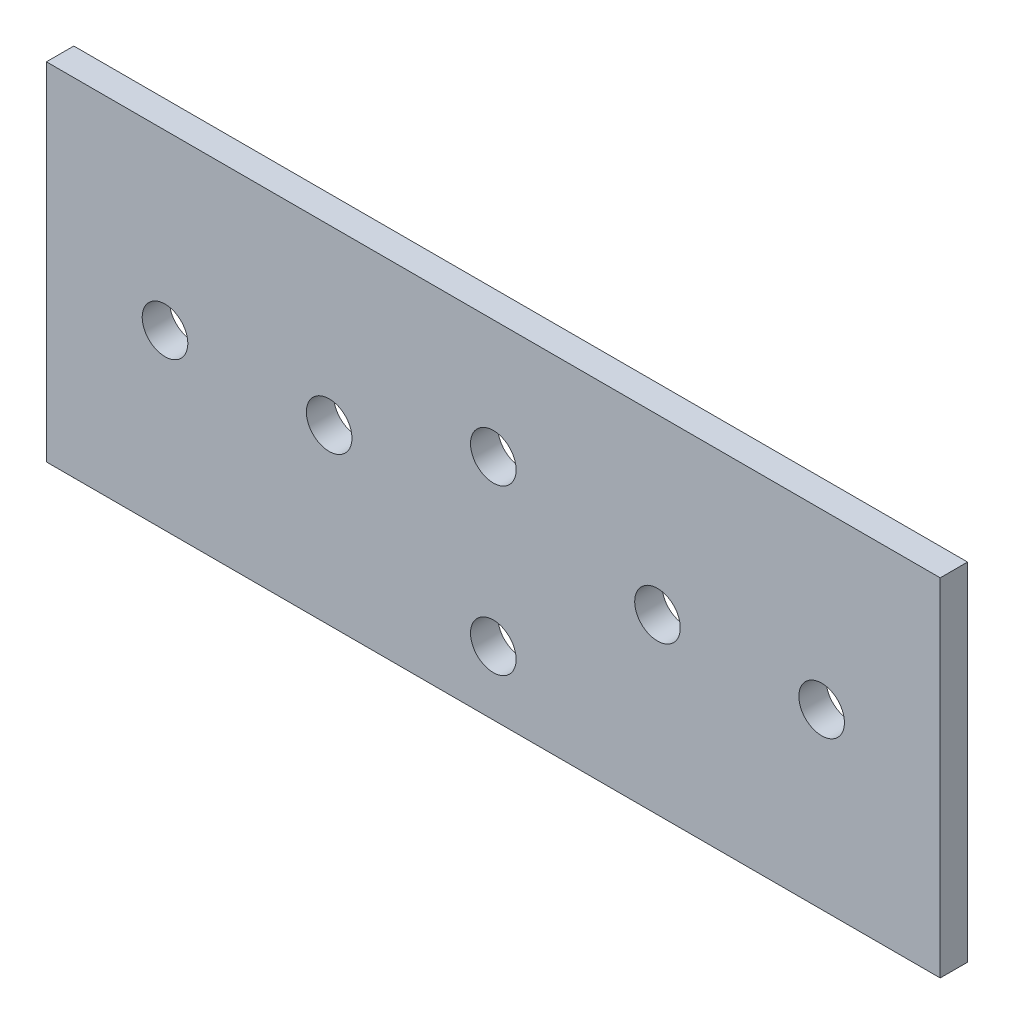
ISO-10303-21;
HEADER;
FILE_DESCRIPTION(('STEP AP214'),'2;1');
FILE_NAME('part.step','',(''),(''),'','','');
FILE_SCHEMA(('AUTOMOTIVE_DESIGN { 1 0 10303 214 1 1 1 1 }'));
ENDSEC;
DATA;
#1=APPLICATION_CONTEXT('core data for automotive mechanical design processes');
#2=APPLICATION_PROTOCOL_DEFINITION('international standard','automotive_design',2000,#1);
#3=PRODUCT_CONTEXT('',#1,'mechanical');
#4=PRODUCT('Part','Part','',(#3));
#5=PRODUCT_RELATED_PRODUCT_CATEGORY('part','',(#4));
#6=PRODUCT_DEFINITION_FORMATION('','',#4);
#7=PRODUCT_DEFINITION_CONTEXT('part definition',#1,'design');
#8=PRODUCT_DEFINITION('design','',#6,#7);
#9=PRODUCT_DEFINITION_SHAPE('','',#8);
#10=(LENGTH_UNIT() NAMED_UNIT(*) SI_UNIT(.MILLI.,.METRE.));
#11=(NAMED_UNIT(*) PLANE_ANGLE_UNIT() SI_UNIT($,.RADIAN.));
#12=(NAMED_UNIT(*) SI_UNIT($,.STERADIAN.) SOLID_ANGLE_UNIT());
#13=UNCERTAINTY_MEASURE_WITH_UNIT(LENGTH_MEASURE(1.E-05),#10,'distance_accuracy_value','');
#14=(GEOMETRIC_REPRESENTATION_CONTEXT(3) GLOBAL_UNCERTAINTY_ASSIGNED_CONTEXT((#13)) GLOBAL_UNIT_ASSIGNED_CONTEXT((#10,
#11,#12)) REPRESENTATION_CONTEXT('',''));
#15=CARTESIAN_POINT('',(0.,0.,0.));
#16=DIRECTION('',(0.,0.,1.));
#17=DIRECTION('',(1.,0.,0.));
#18=AXIS2_PLACEMENT_3D('',#15,#16,#17);
#19=CARTESIAN_POINT('',(49.,19.,3.));
#20=DIRECTION('',(-1.,0.,0.));
#21=DIRECTION('',(0.,-1.,0.));
#22=AXIS2_PLACEMENT_3D('',#19,#20,#21);
#23=PLANE('',#22);
#24=DIRECTION('',(0.,1.,0.));
#25=VECTOR('',#24,1.);
#26=CARTESIAN_POINT('',(49.,19.,0.));
#27=LINE('',#26,#25);
#28=CARTESIAN_POINT('',(49.,-19.,0.));
#29=VERTEX_POINT('',#28);
#30=CARTESIAN_POINT('',(49.,19.,0.));
#31=VERTEX_POINT('',#30);
#32=EDGE_CURVE('E106',#29,#31,#27,.T.);
#33=ORIENTED_EDGE('',*,*,#32,.T.);
#34=DIRECTION('',(0.,0.,-1.));
#35=VECTOR('',#34,1.);
#36=CARTESIAN_POINT('',(49.,19.,3.));
#37=LINE('',#36,#35);
#38=CARTESIAN_POINT('',(49.,19.,3.));
#39=VERTEX_POINT('',#38);
#40=EDGE_CURVE('E11',#39,#31,#37,.T.);
#41=ORIENTED_EDGE('',*,*,#40,.F.);
#42=DIRECTION('',(0.,1.,0.));
#43=VECTOR('',#42,1.);
#44=CARTESIAN_POINT('',(49.,19.,3.));
#45=LINE('',#44,#43);
#46=CARTESIAN_POINT('',(49.,-19.,3.));
#47=VERTEX_POINT('',#46);
#48=EDGE_CURVE('E90',#47,#39,#45,.T.);
#49=ORIENTED_EDGE('',*,*,#48,.F.);
#50=DIRECTION('',(0.,0.,-1.));
#51=VECTOR('',#50,1.);
#52=CARTESIAN_POINT('',(49.,-19.,3.));
#53=LINE('',#52,#51);
#54=EDGE_CURVE('E102',#47,#29,#53,.T.);
#55=ORIENTED_EDGE('',*,*,#54,.T.);
#56=EDGE_LOOP('',(#33,#41,#49,#55));
#57=FACE_BOUND('',#56,.T.);
#58=ADVANCED_FACE('F38',(#57),#23,.F.);
#59=CARTESIAN_POINT('',(-49.,19.,3.));
#60=DIRECTION('',(0.,-1.,0.));
#61=DIRECTION('',(0.,0.,-1.));
#62=AXIS2_PLACEMENT_3D('',#59,#60,#61);
#63=PLANE('',#62);
#64=DIRECTION('',(-1.,0.,0.));
#65=VECTOR('',#64,1.);
#66=CARTESIAN_POINT('',(-49.,19.,0.));
#67=LINE('',#66,#65);
#68=CARTESIAN_POINT('',(-49.,19.,0.));
#69=VERTEX_POINT('',#68);
#70=EDGE_CURVE('E95',#31,#69,#67,.T.);
#71=ORIENTED_EDGE('',*,*,#70,.T.);
#72=DIRECTION('',(0.,0.,-1.));
#73=VECTOR('',#72,1.);
#74=CARTESIAN_POINT('',(-49.,19.,3.));
#75=LINE('',#74,#73);
#76=CARTESIAN_POINT('',(-49.,19.,3.));
#77=VERTEX_POINT('',#76);
#78=EDGE_CURVE('E47',#77,#69,#75,.T.);
#79=ORIENTED_EDGE('',*,*,#78,.F.);
#80=DIRECTION('',(-1.,0.,0.));
#81=VECTOR('',#80,1.);
#82=CARTESIAN_POINT('',(-49.,19.,3.));
#83=LINE('',#82,#81);
#84=EDGE_CURVE('E85',#39,#77,#83,.T.);
#85=ORIENTED_EDGE('',*,*,#84,.F.);
#86=ORIENTED_EDGE('',*,*,#40,.T.);
#87=EDGE_LOOP('',(#71,#79,#85,#86));
#88=FACE_BOUND('',#87,.T.);
#89=ADVANCED_FACE('F94',(#88),#63,.F.);
#90=CARTESIAN_POINT('',(-49.,19.,3.));
#91=DIRECTION('',(1.,0.,0.));
#92=DIRECTION('',(0.,1.,0.));
#93=AXIS2_PLACEMENT_3D('',#90,#91,#92);
#94=PLANE('',#93);
#95=DIRECTION('',(0.,-1.,0.));
#96=VECTOR('',#95,1.);
#97=CARTESIAN_POINT('',(-49.,19.,0.));
#98=LINE('',#97,#96);
#99=CARTESIAN_POINT('',(-49.,-19.,0.));
#100=VERTEX_POINT('',#99);
#101=EDGE_CURVE('E72',#69,#100,#98,.T.);
#102=ORIENTED_EDGE('',*,*,#101,.T.);
#103=DIRECTION('',(0.,0.,-1.));
#104=VECTOR('',#103,1.);
#105=CARTESIAN_POINT('',(-49.,-19.,3.));
#106=LINE('',#105,#104);
#107=CARTESIAN_POINT('',(-49.,-19.,3.));
#108=VERTEX_POINT('',#107);
#109=EDGE_CURVE('E97',#108,#100,#106,.T.);
#110=ORIENTED_EDGE('',*,*,#109,.F.);
#111=DIRECTION('',(0.,-1.,0.));
#112=VECTOR('',#111,1.);
#113=CARTESIAN_POINT('',(-49.,19.,3.));
#114=LINE('',#113,#112);
#115=EDGE_CURVE('E88',#77,#108,#114,.T.);
#116=ORIENTED_EDGE('',*,*,#115,.F.);
#117=ORIENTED_EDGE('',*,*,#78,.T.);
#118=EDGE_LOOP('',(#102,#110,#116,#117));
#119=FACE_BOUND('',#118,.T.);
#120=ADVANCED_FACE('F98',(#119),#94,.F.);
#121=CARTESIAN_POINT('',(-49.,-19.,3.));
#122=DIRECTION('',(0.,1.,0.));
#123=DIRECTION('',(0.,0.,1.));
#124=AXIS2_PLACEMENT_3D('',#121,#122,#123);
#125=PLANE('',#124);
#126=DIRECTION('',(1.,0.,0.));
#127=VECTOR('',#126,1.);
#128=CARTESIAN_POINT('',(-49.,-19.,0.));
#129=LINE('',#128,#127);
#130=EDGE_CURVE('E78',#100,#29,#129,.T.);
#131=ORIENTED_EDGE('',*,*,#130,.T.);
#132=ORIENTED_EDGE('',*,*,#54,.F.);
#133=DIRECTION('',(1.,0.,0.));
#134=VECTOR('',#133,1.);
#135=CARTESIAN_POINT('',(-49.,-19.,3.));
#136=LINE('',#135,#134);
#137=EDGE_CURVE('E55',#108,#47,#136,.T.);
#138=ORIENTED_EDGE('',*,*,#137,.F.);
#139=ORIENTED_EDGE('',*,*,#109,.T.);
#140=EDGE_LOOP('',(#131,#132,#138,#139));
#141=FACE_BOUND('',#140,.T.);
#142=ADVANCED_FACE('F120',(#141),#125,.F.);
#143=CARTESIAN_POINT('',(0.,0.,3.));
#144=DIRECTION('',(0.,0.,1.));
#145=DIRECTION('',(1.,0.,0.));
#146=AXIS2_PLACEMENT_3D('',#143,#144,#145);
#147=PLANE('',#146);
#148=CARTESIAN_POINT('',(0.,-12.,3.));
#149=DIRECTION('',(0.,0.,1.));
#150=DIRECTION('',(1.,0.,0.));
#151=AXIS2_PLACEMENT_3D('',#148,#149,#150);
#152=CIRCLE('',#151,2.5);
#153=CARTESIAN_POINT('',(-2.5,-12.,3.));
#154=VERTEX_POINT('',#153);
#155=EDGE_CURVE('E167',#154,#154,#152,.F.);
#156=ORIENTED_EDGE('',*,*,#155,.T.);
#157=EDGE_LOOP('',(#156));
#158=FACE_BOUND('',#157,.T.);
#159=CARTESIAN_POINT('',(0.,6.,3.));
#160=DIRECTION('',(0.,0.,1.));
#161=DIRECTION('',(1.,0.,0.));
#162=AXIS2_PLACEMENT_3D('',#159,#160,#161);
#163=CIRCLE('',#162,2.5);
#164=CARTESIAN_POINT('',(-2.5,6.,3.));
#165=VERTEX_POINT('',#164);
#166=EDGE_CURVE('E159',#165,#165,#163,.F.);
#167=ORIENTED_EDGE('',*,*,#166,.T.);
#168=EDGE_LOOP('',(#167));
#169=FACE_BOUND('',#168,.T.);
#170=CARTESIAN_POINT('',(-36.,0.,3.));
#171=DIRECTION('',(0.,0.,1.));
#172=DIRECTION('',(1.,0.,0.));
#173=AXIS2_PLACEMENT_3D('',#170,#171,#172);
#174=CIRCLE('',#173,2.5);
#175=CARTESIAN_POINT('',(-38.5,0.,3.));
#176=VERTEX_POINT('',#175);
#177=EDGE_CURVE('E132',#176,#176,#174,.T.);
#178=ORIENTED_EDGE('',*,*,#177,.F.);
#179=EDGE_LOOP('',(#178));
#180=FACE_BOUND('',#179,.T.);
#181=CARTESIAN_POINT('',(-18.,0.,3.));
#182=DIRECTION('',(0.,0.,1.));
#183=DIRECTION('',(1.,0.,0.));
#184=AXIS2_PLACEMENT_3D('',#181,#182,#183);
#185=CIRCLE('',#184,2.5);
#186=CARTESIAN_POINT('',(-20.5,0.,3.));
#187=VERTEX_POINT('',#186);
#188=EDGE_CURVE('E143',#187,#187,#185,.T.);
#189=ORIENTED_EDGE('',*,*,#188,.F.);
#190=EDGE_LOOP('',(#189));
#191=FACE_BOUND('',#190,.T.);
#192=CARTESIAN_POINT('',(36.,0.,3.));
#193=DIRECTION('',(0.,0.,1.));
#194=DIRECTION('',(1.,0.,0.));
#195=AXIS2_PLACEMENT_3D('',#192,#193,#194);
#196=CIRCLE('',#195,2.5);
#197=CARTESIAN_POINT('',(33.5,0.,3.));
#198=VERTEX_POINT('',#197);
#199=EDGE_CURVE('E136',#198,#198,#196,.F.);
#200=ORIENTED_EDGE('',*,*,#199,.T.);
#201=EDGE_LOOP('',(#200));
#202=FACE_BOUND('',#201,.T.);
#203=CARTESIAN_POINT('',(18.,0.,3.));
#204=DIRECTION('',(0.,0.,1.));
#205=DIRECTION('',(1.,0.,0.));
#206=AXIS2_PLACEMENT_3D('',#203,#204,#205);
#207=CIRCLE('',#206,2.5);
#208=CARTESIAN_POINT('',(15.5,0.,3.));
#209=VERTEX_POINT('',#208);
#210=EDGE_CURVE('E127',#209,#209,#207,.F.);
#211=ORIENTED_EDGE('',*,*,#210,.T.);
#212=EDGE_LOOP('',(#211));
#213=FACE_BOUND('',#212,.T.);
#214=ORIENTED_EDGE('',*,*,#48,.T.);
#215=ORIENTED_EDGE('',*,*,#84,.T.);
#216=ORIENTED_EDGE('',*,*,#115,.T.);
#217=ORIENTED_EDGE('',*,*,#137,.T.);
#218=EDGE_LOOP('',(#214,#215,#216,#217));
#219=FACE_BOUND('',#218,.T.);
#220=ADVANCED_FACE('F86',(#158,#169,#180,#191,#202,#213,#219),#147,.T.);
#221=CARTESIAN_POINT('',(0.,0.,0.));
#222=DIRECTION('',(0.,0.,1.));
#223=DIRECTION('',(1.,0.,0.));
#224=AXIS2_PLACEMENT_3D('',#221,#222,#223);
#225=PLANE('',#224);
#226=CARTESIAN_POINT('',(0.,-12.,0.));
#227=DIRECTION('',(0.,0.,-1.));
#228=DIRECTION('',(-1.,0.,0.));
#229=AXIS2_PLACEMENT_3D('',#226,#227,#228);
#230=CIRCLE('',#229,2.5);
#231=CARTESIAN_POINT('',(-2.5,-12.,0.));
#232=VERTEX_POINT('',#231);
#233=EDGE_CURVE('E152',#232,#232,#230,.T.);
#234=ORIENTED_EDGE('',*,*,#233,.F.);
#235=EDGE_LOOP('',(#234));
#236=FACE_BOUND('',#235,.T.);
#237=CARTESIAN_POINT('',(0.,6.,0.));
#238=DIRECTION('',(0.,0.,-1.));
#239=DIRECTION('',(-1.,0.,0.));
#240=AXIS2_PLACEMENT_3D('',#237,#238,#239);
#241=CIRCLE('',#240,2.5);
#242=CARTESIAN_POINT('',(-2.5,6.,0.));
#243=VERTEX_POINT('',#242);
#244=EDGE_CURVE('E163',#243,#243,#241,.T.);
#245=ORIENTED_EDGE('',*,*,#244,.F.);
#246=EDGE_LOOP('',(#245));
#247=FACE_BOUND('',#246,.T.);
#248=CARTESIAN_POINT('',(-36.,0.,0.));
#249=DIRECTION('',(0.,0.,1.));
#250=DIRECTION('',(1.,0.,0.));
#251=AXIS2_PLACEMENT_3D('',#248,#249,#250);
#252=CIRCLE('',#251,2.5);
#253=CARTESIAN_POINT('',(-38.5,0.,0.));
#254=VERTEX_POINT('',#253);
#255=EDGE_CURVE('E147',#254,#254,#252,.T.);
#256=ORIENTED_EDGE('',*,*,#255,.T.);
#257=EDGE_LOOP('',(#256));
#258=FACE_BOUND('',#257,.T.);
#259=CARTESIAN_POINT('',(-18.,0.,0.));
#260=DIRECTION('',(0.,0.,1.));
#261=DIRECTION('',(1.,0.,0.));
#262=AXIS2_PLACEMENT_3D('',#259,#260,#261);
#263=CIRCLE('',#262,2.5);
#264=CARTESIAN_POINT('',(-20.5,0.,0.));
#265=VERTEX_POINT('',#264);
#266=EDGE_CURVE('E148',#265,#265,#263,.T.);
#267=ORIENTED_EDGE('',*,*,#266,.T.);
#268=EDGE_LOOP('',(#267));
#269=FACE_BOUND('',#268,.T.);
#270=CARTESIAN_POINT('',(36.,0.,0.));
#271=DIRECTION('',(0.,0.,-1.));
#272=DIRECTION('',(-1.,0.,0.));
#273=AXIS2_PLACEMENT_3D('',#270,#271,#272);
#274=CIRCLE('',#273,2.5);
#275=CARTESIAN_POINT('',(33.5,0.,0.));
#276=VERTEX_POINT('',#275);
#277=EDGE_CURVE('E110',#276,#276,#274,.T.);
#278=ORIENTED_EDGE('',*,*,#277,.F.);
#279=EDGE_LOOP('',(#278));
#280=FACE_BOUND('',#279,.T.);
#281=CARTESIAN_POINT('',(18.,0.,0.));
#282=DIRECTION('',(0.,0.,-1.));
#283=DIRECTION('',(-1.,0.,0.));
#284=AXIS2_PLACEMENT_3D('',#281,#282,#283);
#285=CIRCLE('',#284,2.5);
#286=CARTESIAN_POINT('',(15.5,0.,0.));
#287=VERTEX_POINT('',#286);
#288=EDGE_CURVE('E131',#287,#287,#285,.T.);
#289=ORIENTED_EDGE('',*,*,#288,.F.);
#290=EDGE_LOOP('',(#289));
#291=FACE_BOUND('',#290,.T.);
#292=ORIENTED_EDGE('',*,*,#32,.F.);
#293=ORIENTED_EDGE('',*,*,#130,.F.);
#294=ORIENTED_EDGE('',*,*,#101,.F.);
#295=ORIENTED_EDGE('',*,*,#70,.F.);
#296=EDGE_LOOP('',(#292,#293,#294,#295));
#297=FACE_BOUND('',#296,.T.);
#298=ADVANCED_FACE('F123',(#236,#247,#258,#269,#280,#291,#297),#225,.F.);
#299=CARTESIAN_POINT('',(18.,0.,3.001));
#300=DIRECTION('',(0.,0.,-1.));
#301=DIRECTION('',(-1.,0.,0.));
#302=AXIS2_PLACEMENT_3D('',#299,#300,#301);
#303=CYLINDRICAL_SURFACE('',#302,2.5);
#304=CARTESIAN_POINT('',(15.5,0.,3.));
#305=CARTESIAN_POINT('',(15.5,0.,2.96875));
#306=CARTESIAN_POINT('',(15.5,0.,2.9375));
#307=CARTESIAN_POINT('',(15.5,0.,2.875));
#308=CARTESIAN_POINT('',(15.5,0.,2.84375));
#309=CARTESIAN_POINT('',(15.5,0.,2.78125));
#310=CARTESIAN_POINT('',(15.5,0.,2.75));
#311=CARTESIAN_POINT('',(15.5,0.,2.6875));
#312=CARTESIAN_POINT('',(15.5,0.,2.65625));
#313=CARTESIAN_POINT('',(15.5,0.,2.59375));
#314=CARTESIAN_POINT('',(15.5,0.,2.5625));
#315=CARTESIAN_POINT('',(15.5,0.,2.5));
#316=CARTESIAN_POINT('',(15.5,0.,2.46875));
#317=CARTESIAN_POINT('',(15.5,0.,2.40625));
#318=CARTESIAN_POINT('',(15.5,0.,2.375));
#319=CARTESIAN_POINT('',(15.5,0.,2.3125));
#320=CARTESIAN_POINT('',(15.5,0.,2.28125));
#321=CARTESIAN_POINT('',(15.5,0.,2.21875));
#322=CARTESIAN_POINT('',(15.5,0.,2.1875));
#323=CARTESIAN_POINT('',(15.5,0.,2.125));
#324=CARTESIAN_POINT('',(15.5,0.,2.09375));
#325=CARTESIAN_POINT('',(15.5,0.,2.03125));
#326=CARTESIAN_POINT('',(15.5,0.,2.));
#327=CARTESIAN_POINT('',(15.5,0.,1.9375));
#328=CARTESIAN_POINT('',(15.5,0.,1.90625));
#329=CARTESIAN_POINT('',(15.5,0.,1.84375));
#330=CARTESIAN_POINT('',(15.5,0.,1.8125));
#331=CARTESIAN_POINT('',(15.5,0.,1.75));
#332=CARTESIAN_POINT('',(15.5,0.,1.71875));
#333=CARTESIAN_POINT('',(15.5,0.,1.65625));
#334=CARTESIAN_POINT('',(15.5,0.,1.625));
#335=CARTESIAN_POINT('',(15.5,0.,1.5625));
#336=CARTESIAN_POINT('',(15.5,0.,1.53125));
#337=CARTESIAN_POINT('',(15.5,0.,1.46875));
#338=CARTESIAN_POINT('',(15.5,0.,1.4375));
#339=CARTESIAN_POINT('',(15.5,0.,1.375));
#340=CARTESIAN_POINT('',(15.5,0.,1.34375));
#341=CARTESIAN_POINT('',(15.5,0.,1.28125));
#342=CARTESIAN_POINT('',(15.5,0.,1.25));
#343=CARTESIAN_POINT('',(15.5,0.,1.1875));
#344=CARTESIAN_POINT('',(15.5,0.,1.15625));
#345=CARTESIAN_POINT('',(15.5,0.,1.09375));
#346=CARTESIAN_POINT('',(15.5,0.,1.0625));
#347=CARTESIAN_POINT('',(15.5,0.,1.));
#348=CARTESIAN_POINT('',(15.5,0.,0.96875));
#349=CARTESIAN_POINT('',(15.5,0.,0.90625));
#350=CARTESIAN_POINT('',(15.5,0.,0.875));
#351=CARTESIAN_POINT('',(15.5,0.,0.8125));
#352=CARTESIAN_POINT('',(15.5,0.,0.78125));
#353=CARTESIAN_POINT('',(15.5,0.,0.71875));
#354=CARTESIAN_POINT('',(15.5,0.,0.6875));
#355=CARTESIAN_POINT('',(15.5,0.,0.625));
#356=CARTESIAN_POINT('',(15.5,0.,0.59375));
#357=CARTESIAN_POINT('',(15.5,0.,0.53125));
#358=CARTESIAN_POINT('',(15.5,0.,0.5));
#359=CARTESIAN_POINT('',(15.5,0.,0.4375));
#360=CARTESIAN_POINT('',(15.5,0.,0.40625));
#361=CARTESIAN_POINT('',(15.5,0.,0.34375));
#362=CARTESIAN_POINT('',(15.5,0.,0.3125));
#363=CARTESIAN_POINT('',(15.5,0.,0.25));
#364=CARTESIAN_POINT('',(15.5,0.,0.21875));
#365=CARTESIAN_POINT('',(15.5,0.,0.156250000000001));
#366=CARTESIAN_POINT('',(15.5,0.,0.125000000000001));
#367=CARTESIAN_POINT('',(15.5,0.,0.0625000000000005));
#368=CARTESIAN_POINT('',(15.5,0.,0.0312500000000005));
#369=CARTESIAN_POINT('',(15.5,0.,0.));
#370=B_SPLINE_CURVE_WITH_KNOTS('',3,(#304,#305,#306,#307,#308,#309,#310,#311,#312,#313,#314,
#315,#316,#317,#318,#319,#320,#321,#322,#323,#324,#325,#326,#327,#328,#329,#330,#331,#332,#333,
#334,#335,#336,#337,#338,#339,#340,#341,#342,#343,#344,#345,#346,#347,#348,#349,#350,#351,#352,
#353,#354,#355,#356,#357,#358,#359,#360,#361,#362,#363,#364,#365,#366,#367,#368,#369),
.UNSPECIFIED.,.F.,.F.,(4,2,2,2,2,2,2,2,2,2,2,2,2,2,2,2,2,2,2,2,2,2,2,2,2,2,2,2,2,2,2,2,4),(0.,
0.0937499999999997,0.1875,0.28125,0.375,0.46875,0.5625,0.65625,0.749999999999999,
0.843749999999999,0.9375,1.03125,1.125,1.21875,1.3125,1.40625,1.5,1.59375,1.6875,1.78125,1.875,
1.96875,2.0625,2.15625,2.25,2.34375,2.4375,2.53125,2.625,2.71875,2.8125,2.90625,3.),.UNSPECIFIED.);
#371=EDGE_CURVE('BSEAM179',#209,#287,#370,.T.);
#372=ORIENTED_EDGE('',*,*,#210,.F.);
#373=ORIENTED_EDGE('',*,*,#288,.T.);
#374=ORIENTED_EDGE('',*,*,#371,.T.);
#375=ORIENTED_EDGE('',*,*,#371,.F.);
#376=EDGE_LOOP('',(#372,#374,#373,#375));
#377=FACE_BOUND('',#376,.T.);
#378=ADVANCED_FACE('F179',(#377),#303,.F.);
#379=CARTESIAN_POINT('',(36.,0.,3.001));
#380=DIRECTION('',(0.,0.,-1.));
#381=DIRECTION('',(-1.,0.,0.));
#382=AXIS2_PLACEMENT_3D('',#379,#380,#381);
#383=CYLINDRICAL_SURFACE('',#382,2.5);
#384=CARTESIAN_POINT('',(33.5,0.,3.));
#385=CARTESIAN_POINT('',(33.5,0.,2.96875));
#386=CARTESIAN_POINT('',(33.5,0.,2.9375));
#387=CARTESIAN_POINT('',(33.5,0.,2.875));
#388=CARTESIAN_POINT('',(33.5,0.,2.84375));
#389=CARTESIAN_POINT('',(33.5,0.,2.78125));
#390=CARTESIAN_POINT('',(33.5,0.,2.75));
#391=CARTESIAN_POINT('',(33.5,0.,2.6875));
#392=CARTESIAN_POINT('',(33.5,0.,2.65625));
#393=CARTESIAN_POINT('',(33.5,0.,2.59375));
#394=CARTESIAN_POINT('',(33.5,0.,2.5625));
#395=CARTESIAN_POINT('',(33.5,0.,2.5));
#396=CARTESIAN_POINT('',(33.5,0.,2.46875));
#397=CARTESIAN_POINT('',(33.5,0.,2.40625));
#398=CARTESIAN_POINT('',(33.5,0.,2.375));
#399=CARTESIAN_POINT('',(33.5,0.,2.3125));
#400=CARTESIAN_POINT('',(33.5,0.,2.28125));
#401=CARTESIAN_POINT('',(33.5,0.,2.21875));
#402=CARTESIAN_POINT('',(33.5,0.,2.1875));
#403=CARTESIAN_POINT('',(33.5,0.,2.125));
#404=CARTESIAN_POINT('',(33.5,0.,2.09375));
#405=CARTESIAN_POINT('',(33.5,0.,2.03125));
#406=CARTESIAN_POINT('',(33.5,0.,2.));
#407=CARTESIAN_POINT('',(33.5,0.,1.9375));
#408=CARTESIAN_POINT('',(33.5,0.,1.90625));
#409=CARTESIAN_POINT('',(33.5,0.,1.84375));
#410=CARTESIAN_POINT('',(33.5,0.,1.8125));
#411=CARTESIAN_POINT('',(33.5,0.,1.75));
#412=CARTESIAN_POINT('',(33.5,0.,1.71875));
#413=CARTESIAN_POINT('',(33.5,0.,1.65625));
#414=CARTESIAN_POINT('',(33.5,0.,1.625));
#415=CARTESIAN_POINT('',(33.5,0.,1.5625));
#416=CARTESIAN_POINT('',(33.5,0.,1.53125));
#417=CARTESIAN_POINT('',(33.5,0.,1.46875));
#418=CARTESIAN_POINT('',(33.5,0.,1.4375));
#419=CARTESIAN_POINT('',(33.5,0.,1.375));
#420=CARTESIAN_POINT('',(33.5,0.,1.34375));
#421=CARTESIAN_POINT('',(33.5,0.,1.28125));
#422=CARTESIAN_POINT('',(33.5,0.,1.25));
#423=CARTESIAN_POINT('',(33.5,0.,1.1875));
#424=CARTESIAN_POINT('',(33.5,0.,1.15625));
#425=CARTESIAN_POINT('',(33.5,0.,1.09375));
#426=CARTESIAN_POINT('',(33.5,0.,1.0625));
#427=CARTESIAN_POINT('',(33.5,0.,1.));
#428=CARTESIAN_POINT('',(33.5,0.,0.96875));
#429=CARTESIAN_POINT('',(33.5,0.,0.90625));
#430=CARTESIAN_POINT('',(33.5,0.,0.875));
#431=CARTESIAN_POINT('',(33.5,0.,0.8125));
#432=CARTESIAN_POINT('',(33.5,0.,0.78125));
#433=CARTESIAN_POINT('',(33.5,0.,0.71875));
#434=CARTESIAN_POINT('',(33.5,0.,0.6875));
#435=CARTESIAN_POINT('',(33.5,0.,0.625));
#436=CARTESIAN_POINT('',(33.5,0.,0.59375));
#437=CARTESIAN_POINT('',(33.5,0.,0.53125));
#438=CARTESIAN_POINT('',(33.5,0.,0.5));
#439=CARTESIAN_POINT('',(33.5,0.,0.4375));
#440=CARTESIAN_POINT('',(33.5,0.,0.40625));
#441=CARTESIAN_POINT('',(33.5,0.,0.34375));
#442=CARTESIAN_POINT('',(33.5,0.,0.3125));
#443=CARTESIAN_POINT('',(33.5,0.,0.25));
#444=CARTESIAN_POINT('',(33.5,0.,0.21875));
#445=CARTESIAN_POINT('',(33.5,0.,0.156250000000001));
#446=CARTESIAN_POINT('',(33.5,0.,0.125000000000001));
#447=CARTESIAN_POINT('',(33.5,0.,0.0625000000000005));
#448=CARTESIAN_POINT('',(33.5,0.,0.0312500000000005));
#449=CARTESIAN_POINT('',(33.5,0.,0.));
#450=B_SPLINE_CURVE_WITH_KNOTS('',3,(#384,#385,#386,#387,#388,#389,#390,#391,#392,#393,#394,
#395,#396,#397,#398,#399,#400,#401,#402,#403,#404,#405,#406,#407,#408,#409,#410,#411,#412,#413,
#414,#415,#416,#417,#418,#419,#420,#421,#422,#423,#424,#425,#426,#427,#428,#429,#430,#431,#432,
#433,#434,#435,#436,#437,#438,#439,#440,#441,#442,#443,#444,#445,#446,#447,#448,#449),
.UNSPECIFIED.,.F.,.F.,(4,2,2,2,2,2,2,2,2,2,2,2,2,2,2,2,2,2,2,2,2,2,2,2,2,2,2,2,2,2,2,2,4),(0.,
0.0937499999999997,0.1875,0.28125,0.375,0.46875,0.5625,0.65625,0.749999999999999,
0.843749999999999,0.9375,1.03125,1.125,1.21875,1.3125,1.40625,1.5,1.59375,1.6875,1.78125,1.875,
1.96875,2.0625,2.15625,2.25,2.34375,2.4375,2.53125,2.625,2.71875,2.8125,2.90625,3.),.UNSPECIFIED.);
#451=EDGE_CURVE('BSEAM192',#198,#276,#450,.T.);
#452=ORIENTED_EDGE('',*,*,#199,.F.);
#453=ORIENTED_EDGE('',*,*,#277,.T.);
#454=ORIENTED_EDGE('',*,*,#451,.T.);
#455=ORIENTED_EDGE('',*,*,#451,.F.);
#456=EDGE_LOOP('',(#452,#454,#453,#455));
#457=FACE_BOUND('',#456,.T.);
#458=ADVANCED_FACE('F192',(#457),#383,.F.);
#459=CARTESIAN_POINT('',(-18.,0.,3.001));
#460=DIRECTION('',(0.,0.,-1.));
#461=DIRECTION('',(-1.,0.,0.));
#462=AXIS2_PLACEMENT_3D('',#459,#460,#461);
#463=CYLINDRICAL_SURFACE('',#462,2.5);
#464=CARTESIAN_POINT('',(-20.5,0.,3.));
#465=CARTESIAN_POINT('',(-20.5,0.,2.96875));
#466=CARTESIAN_POINT('',(-20.5,0.,2.9375));
#467=CARTESIAN_POINT('',(-20.5,0.,2.875));
#468=CARTESIAN_POINT('',(-20.5,0.,2.84375));
#469=CARTESIAN_POINT('',(-20.5,0.,2.78125));
#470=CARTESIAN_POINT('',(-20.5,0.,2.75));
#471=CARTESIAN_POINT('',(-20.5,0.,2.6875));
#472=CARTESIAN_POINT('',(-20.5,0.,2.65625));
#473=CARTESIAN_POINT('',(-20.5,0.,2.59375));
#474=CARTESIAN_POINT('',(-20.5,0.,2.5625));
#475=CARTESIAN_POINT('',(-20.5,0.,2.5));
#476=CARTESIAN_POINT('',(-20.5,0.,2.46875));
#477=CARTESIAN_POINT('',(-20.5,0.,2.40625));
#478=CARTESIAN_POINT('',(-20.5,0.,2.375));
#479=CARTESIAN_POINT('',(-20.5,0.,2.3125));
#480=CARTESIAN_POINT('',(-20.5,0.,2.28125));
#481=CARTESIAN_POINT('',(-20.5,0.,2.21875));
#482=CARTESIAN_POINT('',(-20.5,0.,2.1875));
#483=CARTESIAN_POINT('',(-20.5,0.,2.125));
#484=CARTESIAN_POINT('',(-20.5,0.,2.09375));
#485=CARTESIAN_POINT('',(-20.5,0.,2.03125));
#486=CARTESIAN_POINT('',(-20.5,0.,2.));
#487=CARTESIAN_POINT('',(-20.5,0.,1.9375));
#488=CARTESIAN_POINT('',(-20.5,0.,1.90625));
#489=CARTESIAN_POINT('',(-20.5,0.,1.84375));
#490=CARTESIAN_POINT('',(-20.5,0.,1.8125));
#491=CARTESIAN_POINT('',(-20.5,0.,1.75));
#492=CARTESIAN_POINT('',(-20.5,0.,1.71875));
#493=CARTESIAN_POINT('',(-20.5,0.,1.65625));
#494=CARTESIAN_POINT('',(-20.5,0.,1.625));
#495=CARTESIAN_POINT('',(-20.5,0.,1.5625));
#496=CARTESIAN_POINT('',(-20.5,0.,1.53125));
#497=CARTESIAN_POINT('',(-20.5,0.,1.46875));
#498=CARTESIAN_POINT('',(-20.5,0.,1.4375));
#499=CARTESIAN_POINT('',(-20.5,0.,1.375));
#500=CARTESIAN_POINT('',(-20.5,0.,1.34375));
#501=CARTESIAN_POINT('',(-20.5,0.,1.28125));
#502=CARTESIAN_POINT('',(-20.5,0.,1.25));
#503=CARTESIAN_POINT('',(-20.5,0.,1.1875));
#504=CARTESIAN_POINT('',(-20.5,0.,1.15625));
#505=CARTESIAN_POINT('',(-20.5,0.,1.09375));
#506=CARTESIAN_POINT('',(-20.5,0.,1.0625));
#507=CARTESIAN_POINT('',(-20.5,0.,1.));
#508=CARTESIAN_POINT('',(-20.5,0.,0.96875));
#509=CARTESIAN_POINT('',(-20.5,0.,0.90625));
#510=CARTESIAN_POINT('',(-20.5,0.,0.875));
#511=CARTESIAN_POINT('',(-20.5,0.,0.8125));
#512=CARTESIAN_POINT('',(-20.5,0.,0.78125));
#513=CARTESIAN_POINT('',(-20.5,0.,0.71875));
#514=CARTESIAN_POINT('',(-20.5,0.,0.6875));
#515=CARTESIAN_POINT('',(-20.5,0.,0.625));
#516=CARTESIAN_POINT('',(-20.5,0.,0.59375));
#517=CARTESIAN_POINT('',(-20.5,0.,0.53125));
#518=CARTESIAN_POINT('',(-20.5,0.,0.5));
#519=CARTESIAN_POINT('',(-20.5,0.,0.4375));
#520=CARTESIAN_POINT('',(-20.5,0.,0.40625));
#521=CARTESIAN_POINT('',(-20.5,0.,0.34375));
#522=CARTESIAN_POINT('',(-20.5,0.,0.3125));
#523=CARTESIAN_POINT('',(-20.5,0.,0.25));
#524=CARTESIAN_POINT('',(-20.5,0.,0.21875));
#525=CARTESIAN_POINT('',(-20.5,0.,0.15625));
#526=CARTESIAN_POINT('',(-20.5,0.,0.125));
#527=CARTESIAN_POINT('',(-20.5,0.,0.0624999999999996));
#528=CARTESIAN_POINT('',(-20.5,0.,0.0312499999999996));
#529=CARTESIAN_POINT('',(-20.5,0.,0.));
#530=B_SPLINE_CURVE_WITH_KNOTS('',3,(#464,#465,#466,#467,#468,#469,#470,#471,#472,#473,#474,
#475,#476,#477,#478,#479,#480,#481,#482,#483,#484,#485,#486,#487,#488,#489,#490,#491,#492,#493,
#494,#495,#496,#497,#498,#499,#500,#501,#502,#503,#504,#505,#506,#507,#508,#509,#510,#511,#512,
#513,#514,#515,#516,#517,#518,#519,#520,#521,#522,#523,#524,#525,#526,#527,#528,#529),
.UNSPECIFIED.,.F.,.F.,(4,2,2,2,2,2,2,2,2,2,2,2,2,2,2,2,2,2,2,2,2,2,2,2,2,2,2,2,2,2,2,2,4),(0.,
0.0937499999999997,0.1875,0.28125,0.375,0.46875,0.5625,0.65625,0.75,0.84375,0.9375,1.03125,
1.125,1.21875,1.3125,1.40625,1.5,1.59375,1.6875,1.78125,1.875,1.96875,2.0625,2.15625,2.25,
2.34375,2.4375,2.53125,2.625,2.71875,2.8125,2.90625,3.),.UNSPECIFIED.);
#531=EDGE_CURVE('BSEAM199',#187,#265,#530,.T.);
#532=ORIENTED_EDGE('',*,*,#188,.T.);
#533=ORIENTED_EDGE('',*,*,#266,.F.);
#534=ORIENTED_EDGE('',*,*,#531,.T.);
#535=ORIENTED_EDGE('',*,*,#531,.F.);
#536=EDGE_LOOP('',(#532,#534,#533,#535));
#537=FACE_BOUND('',#536,.T.);
#538=ADVANCED_FACE('F199',(#537),#463,.F.);
#539=CARTESIAN_POINT('',(-36.,0.,3.001));
#540=DIRECTION('',(0.,0.,-1.));
#541=DIRECTION('',(-1.,0.,0.));
#542=AXIS2_PLACEMENT_3D('',#539,#540,#541);
#543=CYLINDRICAL_SURFACE('',#542,2.5);
#544=CARTESIAN_POINT('',(-38.5,0.,3.));
#545=CARTESIAN_POINT('',(-38.5,0.,2.96875));
#546=CARTESIAN_POINT('',(-38.5,0.,2.9375));
#547=CARTESIAN_POINT('',(-38.5,0.,2.875));
#548=CARTESIAN_POINT('',(-38.5,0.,2.84375));
#549=CARTESIAN_POINT('',(-38.5,0.,2.78125));
#550=CARTESIAN_POINT('',(-38.5,0.,2.75));
#551=CARTESIAN_POINT('',(-38.5,0.,2.6875));
#552=CARTESIAN_POINT('',(-38.5,0.,2.65625));
#553=CARTESIAN_POINT('',(-38.5,0.,2.59375));
#554=CARTESIAN_POINT('',(-38.5,0.,2.5625));
#555=CARTESIAN_POINT('',(-38.5,0.,2.5));
#556=CARTESIAN_POINT('',(-38.5,0.,2.46875));
#557=CARTESIAN_POINT('',(-38.5,0.,2.40625));
#558=CARTESIAN_POINT('',(-38.5,0.,2.375));
#559=CARTESIAN_POINT('',(-38.5,0.,2.3125));
#560=CARTESIAN_POINT('',(-38.5,0.,2.28125));
#561=CARTESIAN_POINT('',(-38.5,0.,2.21875));
#562=CARTESIAN_POINT('',(-38.5,0.,2.1875));
#563=CARTESIAN_POINT('',(-38.5,0.,2.125));
#564=CARTESIAN_POINT('',(-38.5,0.,2.09375));
#565=CARTESIAN_POINT('',(-38.5,0.,2.03125));
#566=CARTESIAN_POINT('',(-38.5,0.,2.));
#567=CARTESIAN_POINT('',(-38.5,0.,1.9375));
#568=CARTESIAN_POINT('',(-38.5,0.,1.90625));
#569=CARTESIAN_POINT('',(-38.5,0.,1.84375));
#570=CARTESIAN_POINT('',(-38.5,0.,1.8125));
#571=CARTESIAN_POINT('',(-38.5,0.,1.75));
#572=CARTESIAN_POINT('',(-38.5,0.,1.71875));
#573=CARTESIAN_POINT('',(-38.5,0.,1.65625));
#574=CARTESIAN_POINT('',(-38.5,0.,1.625));
#575=CARTESIAN_POINT('',(-38.5,0.,1.5625));
#576=CARTESIAN_POINT('',(-38.5,0.,1.53125));
#577=CARTESIAN_POINT('',(-38.5,0.,1.46875));
#578=CARTESIAN_POINT('',(-38.5,0.,1.4375));
#579=CARTESIAN_POINT('',(-38.5,0.,1.375));
#580=CARTESIAN_POINT('',(-38.5,0.,1.34375));
#581=CARTESIAN_POINT('',(-38.5,0.,1.28125));
#582=CARTESIAN_POINT('',(-38.5,0.,1.25));
#583=CARTESIAN_POINT('',(-38.5,0.,1.1875));
#584=CARTESIAN_POINT('',(-38.5,0.,1.15625));
#585=CARTESIAN_POINT('',(-38.5,0.,1.09375));
#586=CARTESIAN_POINT('',(-38.5,0.,1.0625));
#587=CARTESIAN_POINT('',(-38.5,0.,1.));
#588=CARTESIAN_POINT('',(-38.5,0.,0.96875));
#589=CARTESIAN_POINT('',(-38.5,0.,0.90625));
#590=CARTESIAN_POINT('',(-38.5,0.,0.875));
#591=CARTESIAN_POINT('',(-38.5,0.,0.8125));
#592=CARTESIAN_POINT('',(-38.5,0.,0.78125));
#593=CARTESIAN_POINT('',(-38.5,0.,0.71875));
#594=CARTESIAN_POINT('',(-38.5,0.,0.6875));
#595=CARTESIAN_POINT('',(-38.5,0.,0.625));
#596=CARTESIAN_POINT('',(-38.5,0.,0.59375));
#597=CARTESIAN_POINT('',(-38.5,0.,0.53125));
#598=CARTESIAN_POINT('',(-38.5,0.,0.5));
#599=CARTESIAN_POINT('',(-38.5,0.,0.4375));
#600=CARTESIAN_POINT('',(-38.5,0.,0.40625));
#601=CARTESIAN_POINT('',(-38.5,0.,0.34375));
#602=CARTESIAN_POINT('',(-38.5,0.,0.3125));
#603=CARTESIAN_POINT('',(-38.5,0.,0.25));
#604=CARTESIAN_POINT('',(-38.5,0.,0.21875));
#605=CARTESIAN_POINT('',(-38.5,0.,0.15625));
#606=CARTESIAN_POINT('',(-38.5,0.,0.125));
#607=CARTESIAN_POINT('',(-38.5,0.,0.0624999999999996));
#608=CARTESIAN_POINT('',(-38.5,0.,0.0312499999999996));
#609=CARTESIAN_POINT('',(-38.5,0.,0.));
#610=B_SPLINE_CURVE_WITH_KNOTS('',3,(#544,#545,#546,#547,#548,#549,#550,#551,#552,#553,#554,
#555,#556,#557,#558,#559,#560,#561,#562,#563,#564,#565,#566,#567,#568,#569,#570,#571,#572,#573,
#574,#575,#576,#577,#578,#579,#580,#581,#582,#583,#584,#585,#586,#587,#588,#589,#590,#591,#592,
#593,#594,#595,#596,#597,#598,#599,#600,#601,#602,#603,#604,#605,#606,#607,#608,#609),
.UNSPECIFIED.,.F.,.F.,(4,2,2,2,2,2,2,2,2,2,2,2,2,2,2,2,2,2,2,2,2,2,2,2,2,2,2,2,2,2,2,2,4),(0.,
0.0937499999999997,0.1875,0.28125,0.375,0.46875,0.5625,0.65625,0.75,0.84375,0.9375,1.03125,
1.125,1.21875,1.3125,1.40625,1.5,1.59375,1.6875,1.78125,1.875,1.96875,2.0625,2.15625,2.25,
2.34375,2.4375,2.53125,2.625,2.71875,2.8125,2.90625,3.),.UNSPECIFIED.);
#611=EDGE_CURVE('BSEAM233',#176,#254,#610,.T.);
#612=ORIENTED_EDGE('',*,*,#177,.T.);
#613=ORIENTED_EDGE('',*,*,#255,.F.);
#614=ORIENTED_EDGE('',*,*,#611,.T.);
#615=ORIENTED_EDGE('',*,*,#611,.F.);
#616=EDGE_LOOP('',(#612,#614,#613,#615));
#617=FACE_BOUND('',#616,.T.);
#618=ADVANCED_FACE('F233',(#617),#543,.F.);
#619=CARTESIAN_POINT('',(0.,6.,3.001));
#620=DIRECTION('',(0.,0.,-1.));
#621=DIRECTION('',(-1.,0.,0.));
#622=AXIS2_PLACEMENT_3D('',#619,#620,#621);
#623=CYLINDRICAL_SURFACE('',#622,2.5);
#624=CARTESIAN_POINT('',(-2.5,6.,3.));
#625=CARTESIAN_POINT('',(-2.5,6.,2.96875));
#626=CARTESIAN_POINT('',(-2.5,6.,2.9375));
#627=CARTESIAN_POINT('',(-2.5,6.,2.875));
#628=CARTESIAN_POINT('',(-2.5,6.,2.84375));
#629=CARTESIAN_POINT('',(-2.5,6.,2.78125));
#630=CARTESIAN_POINT('',(-2.5,6.,2.75));
#631=CARTESIAN_POINT('',(-2.5,6.,2.6875));
#632=CARTESIAN_POINT('',(-2.5,6.,2.65625));
#633=CARTESIAN_POINT('',(-2.5,6.,2.59375));
#634=CARTESIAN_POINT('',(-2.5,6.,2.5625));
#635=CARTESIAN_POINT('',(-2.5,6.,2.5));
#636=CARTESIAN_POINT('',(-2.5,6.,2.46875));
#637=CARTESIAN_POINT('',(-2.5,6.,2.40625));
#638=CARTESIAN_POINT('',(-2.5,6.,2.375));
#639=CARTESIAN_POINT('',(-2.5,6.,2.3125));
#640=CARTESIAN_POINT('',(-2.5,6.,2.28125));
#641=CARTESIAN_POINT('',(-2.5,6.,2.21875));
#642=CARTESIAN_POINT('',(-2.5,6.,2.1875));
#643=CARTESIAN_POINT('',(-2.5,6.,2.125));
#644=CARTESIAN_POINT('',(-2.5,6.,2.09375));
#645=CARTESIAN_POINT('',(-2.5,6.,2.03125));
#646=CARTESIAN_POINT('',(-2.5,6.,2.));
#647=CARTESIAN_POINT('',(-2.5,6.,1.9375));
#648=CARTESIAN_POINT('',(-2.5,6.,1.90625));
#649=CARTESIAN_POINT('',(-2.5,6.,1.84375));
#650=CARTESIAN_POINT('',(-2.5,6.,1.8125));
#651=CARTESIAN_POINT('',(-2.5,6.,1.75));
#652=CARTESIAN_POINT('',(-2.5,6.,1.71875));
#653=CARTESIAN_POINT('',(-2.5,6.,1.65625));
#654=CARTESIAN_POINT('',(-2.5,6.,1.625));
#655=CARTESIAN_POINT('',(-2.5,6.,1.5625));
#656=CARTESIAN_POINT('',(-2.5,6.,1.53125));
#657=CARTESIAN_POINT('',(-2.5,6.,1.46875));
#658=CARTESIAN_POINT('',(-2.5,6.,1.4375));
#659=CARTESIAN_POINT('',(-2.5,6.,1.375));
#660=CARTESIAN_POINT('',(-2.5,6.,1.34375));
#661=CARTESIAN_POINT('',(-2.5,6.,1.28125));
#662=CARTESIAN_POINT('',(-2.5,6.,1.25));
#663=CARTESIAN_POINT('',(-2.5,6.,1.1875));
#664=CARTESIAN_POINT('',(-2.5,6.,1.15625));
#665=CARTESIAN_POINT('',(-2.5,6.,1.09375));
#666=CARTESIAN_POINT('',(-2.5,6.,1.0625));
#667=CARTESIAN_POINT('',(-2.5,6.,1.));
#668=CARTESIAN_POINT('',(-2.5,6.,0.96875));
#669=CARTESIAN_POINT('',(-2.5,6.,0.90625));
#670=CARTESIAN_POINT('',(-2.5,6.,0.875));
#671=CARTESIAN_POINT('',(-2.5,6.,0.8125));
#672=CARTESIAN_POINT('',(-2.5,6.,0.78125));
#673=CARTESIAN_POINT('',(-2.5,6.,0.71875));
#674=CARTESIAN_POINT('',(-2.5,6.,0.6875));
#675=CARTESIAN_POINT('',(-2.5,6.,0.625));
#676=CARTESIAN_POINT('',(-2.5,6.,0.59375));
#677=CARTESIAN_POINT('',(-2.5,6.,0.53125));
#678=CARTESIAN_POINT('',(-2.5,6.,0.5));
#679=CARTESIAN_POINT('',(-2.5,6.,0.4375));
#680=CARTESIAN_POINT('',(-2.5,6.,0.40625));
#681=CARTESIAN_POINT('',(-2.5,6.,0.34375));
#682=CARTESIAN_POINT('',(-2.5,6.,0.3125));
#683=CARTESIAN_POINT('',(-2.5,6.,0.25));
#684=CARTESIAN_POINT('',(-2.5,6.,0.21875));
#685=CARTESIAN_POINT('',(-2.5,6.,0.156250000000001));
#686=CARTESIAN_POINT('',(-2.5,6.,0.125000000000001));
#687=CARTESIAN_POINT('',(-2.5,6.,0.0625000000000005));
#688=CARTESIAN_POINT('',(-2.5,6.,0.0312500000000005));
#689=CARTESIAN_POINT('',(-2.5,6.,0.));
#690=B_SPLINE_CURVE_WITH_KNOTS('',3,(#624,#625,#626,#627,#628,#629,#630,#631,#632,#633,#634,
#635,#636,#637,#638,#639,#640,#641,#642,#643,#644,#645,#646,#647,#648,#649,#650,#651,#652,#653,
#654,#655,#656,#657,#658,#659,#660,#661,#662,#663,#664,#665,#666,#667,#668,#669,#670,#671,#672,
#673,#674,#675,#676,#677,#678,#679,#680,#681,#682,#683,#684,#685,#686,#687,#688,#689),
.UNSPECIFIED.,.F.,.F.,(4,2,2,2,2,2,2,2,2,2,2,2,2,2,2,2,2,2,2,2,2,2,2,2,2,2,2,2,2,2,2,2,4),(0.,
0.0937499999999997,0.1875,0.28125,0.375,0.46875,0.5625,0.65625,0.749999999999999,
0.843749999999999,0.9375,1.03125,1.125,1.21875,1.3125,1.40625,1.5,1.59375,1.6875,1.78125,1.875,
1.96875,2.0625,2.15625,2.25,2.34375,2.4375,2.53125,2.625,2.71875,2.8125,2.90625,3.),.UNSPECIFIED.);
#691=EDGE_CURVE('BSEAM238',#165,#243,#690,.T.);
#692=ORIENTED_EDGE('',*,*,#166,.F.);
#693=ORIENTED_EDGE('',*,*,#244,.T.);
#694=ORIENTED_EDGE('',*,*,#691,.T.);
#695=ORIENTED_EDGE('',*,*,#691,.F.);
#696=EDGE_LOOP('',(#692,#694,#693,#695));
#697=FACE_BOUND('',#696,.T.);
#698=ADVANCED_FACE('F238',(#697),#623,.F.);
#699=CARTESIAN_POINT('',(0.,-12.,3.001));
#700=DIRECTION('',(0.,0.,-1.));
#701=DIRECTION('',(-1.,0.,0.));
#702=AXIS2_PLACEMENT_3D('',#699,#700,#701);
#703=CYLINDRICAL_SURFACE('',#702,2.5);
#704=CARTESIAN_POINT('',(-2.5,-12.,3.));
#705=CARTESIAN_POINT('',(-2.5,-12.,2.96875));
#706=CARTESIAN_POINT('',(-2.5,-12.,2.9375));
#707=CARTESIAN_POINT('',(-2.5,-12.,2.875));
#708=CARTESIAN_POINT('',(-2.5,-12.,2.84375));
#709=CARTESIAN_POINT('',(-2.5,-12.,2.78125));
#710=CARTESIAN_POINT('',(-2.5,-12.,2.75));
#711=CARTESIAN_POINT('',(-2.5,-12.,2.6875));
#712=CARTESIAN_POINT('',(-2.5,-12.,2.65625));
#713=CARTESIAN_POINT('',(-2.5,-12.,2.59375));
#714=CARTESIAN_POINT('',(-2.5,-12.,2.5625));
#715=CARTESIAN_POINT('',(-2.5,-12.,2.5));
#716=CARTESIAN_POINT('',(-2.5,-12.,2.46875));
#717=CARTESIAN_POINT('',(-2.5,-12.,2.40625));
#718=CARTESIAN_POINT('',(-2.5,-12.,2.375));
#719=CARTESIAN_POINT('',(-2.5,-12.,2.3125));
#720=CARTESIAN_POINT('',(-2.5,-12.,2.28125));
#721=CARTESIAN_POINT('',(-2.5,-12.,2.21875));
#722=CARTESIAN_POINT('',(-2.5,-12.,2.1875));
#723=CARTESIAN_POINT('',(-2.5,-12.,2.125));
#724=CARTESIAN_POINT('',(-2.5,-12.,2.09375));
#725=CARTESIAN_POINT('',(-2.5,-12.,2.03125));
#726=CARTESIAN_POINT('',(-2.5,-12.,2.));
#727=CARTESIAN_POINT('',(-2.5,-12.,1.9375));
#728=CARTESIAN_POINT('',(-2.5,-12.,1.90625));
#729=CARTESIAN_POINT('',(-2.5,-12.,1.84375));
#730=CARTESIAN_POINT('',(-2.5,-12.,1.8125));
#731=CARTESIAN_POINT('',(-2.5,-12.,1.75));
#732=CARTESIAN_POINT('',(-2.5,-12.,1.71875));
#733=CARTESIAN_POINT('',(-2.5,-12.,1.65625));
#734=CARTESIAN_POINT('',(-2.5,-12.,1.625));
#735=CARTESIAN_POINT('',(-2.5,-12.,1.5625));
#736=CARTESIAN_POINT('',(-2.5,-12.,1.53125));
#737=CARTESIAN_POINT('',(-2.5,-12.,1.46875));
#738=CARTESIAN_POINT('',(-2.5,-12.,1.4375));
#739=CARTESIAN_POINT('',(-2.5,-12.,1.375));
#740=CARTESIAN_POINT('',(-2.5,-12.,1.34375));
#741=CARTESIAN_POINT('',(-2.5,-12.,1.28125));
#742=CARTESIAN_POINT('',(-2.5,-12.,1.25));
#743=CARTESIAN_POINT('',(-2.5,-12.,1.1875));
#744=CARTESIAN_POINT('',(-2.5,-12.,1.15625));
#745=CARTESIAN_POINT('',(-2.5,-12.,1.09375));
#746=CARTESIAN_POINT('',(-2.5,-12.,1.0625));
#747=CARTESIAN_POINT('',(-2.5,-12.,1.));
#748=CARTESIAN_POINT('',(-2.5,-12.,0.96875));
#749=CARTESIAN_POINT('',(-2.5,-12.,0.90625));
#750=CARTESIAN_POINT('',(-2.5,-12.,0.875));
#751=CARTESIAN_POINT('',(-2.5,-12.,0.8125));
#752=CARTESIAN_POINT('',(-2.5,-12.,0.78125));
#753=CARTESIAN_POINT('',(-2.5,-12.,0.71875));
#754=CARTESIAN_POINT('',(-2.5,-12.,0.6875));
#755=CARTESIAN_POINT('',(-2.5,-12.,0.625));
#756=CARTESIAN_POINT('',(-2.5,-12.,0.59375));
#757=CARTESIAN_POINT('',(-2.5,-12.,0.53125));
#758=CARTESIAN_POINT('',(-2.5,-12.,0.5));
#759=CARTESIAN_POINT('',(-2.5,-12.,0.4375));
#760=CARTESIAN_POINT('',(-2.5,-12.,0.40625));
#761=CARTESIAN_POINT('',(-2.5,-12.,0.34375));
#762=CARTESIAN_POINT('',(-2.5,-12.,0.3125));
#763=CARTESIAN_POINT('',(-2.5,-12.,0.25));
#764=CARTESIAN_POINT('',(-2.5,-12.,0.21875));
#765=CARTESIAN_POINT('',(-2.5,-12.,0.156250000000001));
#766=CARTESIAN_POINT('',(-2.5,-12.,0.125000000000001));
#767=CARTESIAN_POINT('',(-2.5,-12.,0.0625000000000005));
#768=CARTESIAN_POINT('',(-2.5,-12.,0.0312500000000005));
#769=CARTESIAN_POINT('',(-2.5,-12.,0.));
#770=B_SPLINE_CURVE_WITH_KNOTS('',3,(#704,#705,#706,#707,#708,#709,#710,#711,#712,#713,#714,
#715,#716,#717,#718,#719,#720,#721,#722,#723,#724,#725,#726,#727,#728,#729,#730,#731,#732,#733,
#734,#735,#736,#737,#738,#739,#740,#741,#742,#743,#744,#745,#746,#747,#748,#749,#750,#751,#752,
#753,#754,#755,#756,#757,#758,#759,#760,#761,#762,#763,#764,#765,#766,#767,#768,#769),
.UNSPECIFIED.,.F.,.F.,(4,2,2,2,2,2,2,2,2,2,2,2,2,2,2,2,2,2,2,2,2,2,2,2,2,2,2,2,2,2,2,2,4),(0.,
0.0937499999999997,0.1875,0.28125,0.375,0.46875,0.5625,0.65625,0.749999999999999,
0.843749999999999,0.9375,1.03125,1.125,1.21875,1.3125,1.40625,1.5,1.59375,1.6875,1.78125,1.875,
1.96875,2.0625,2.15625,2.25,2.34375,2.4375,2.53125,2.625,2.71875,2.8125,2.90625,3.),.UNSPECIFIED.);
#771=EDGE_CURVE('BSEAM175',#154,#232,#770,.T.);
#772=ORIENTED_EDGE('',*,*,#155,.F.);
#773=ORIENTED_EDGE('',*,*,#233,.T.);
#774=ORIENTED_EDGE('',*,*,#771,.T.);
#775=ORIENTED_EDGE('',*,*,#771,.F.);
#776=EDGE_LOOP('',(#772,#774,#773,#775));
#777=FACE_BOUND('',#776,.T.);
#778=ADVANCED_FACE('F175',(#777),#703,.F.);
#779=CLOSED_SHELL('',(#58,#89,#120,#142,#220,#298,#378,#458,#538,#618,#698,#778));
#780=MANIFOLD_SOLID_BREP('B2',#779);
#781=ADVANCED_BREP_SHAPE_REPRESENTATION('',(#18,#780),#14);
#782=SHAPE_DEFINITION_REPRESENTATION(#9,#781);
ENDSEC;
END-ISO-10303-21;
